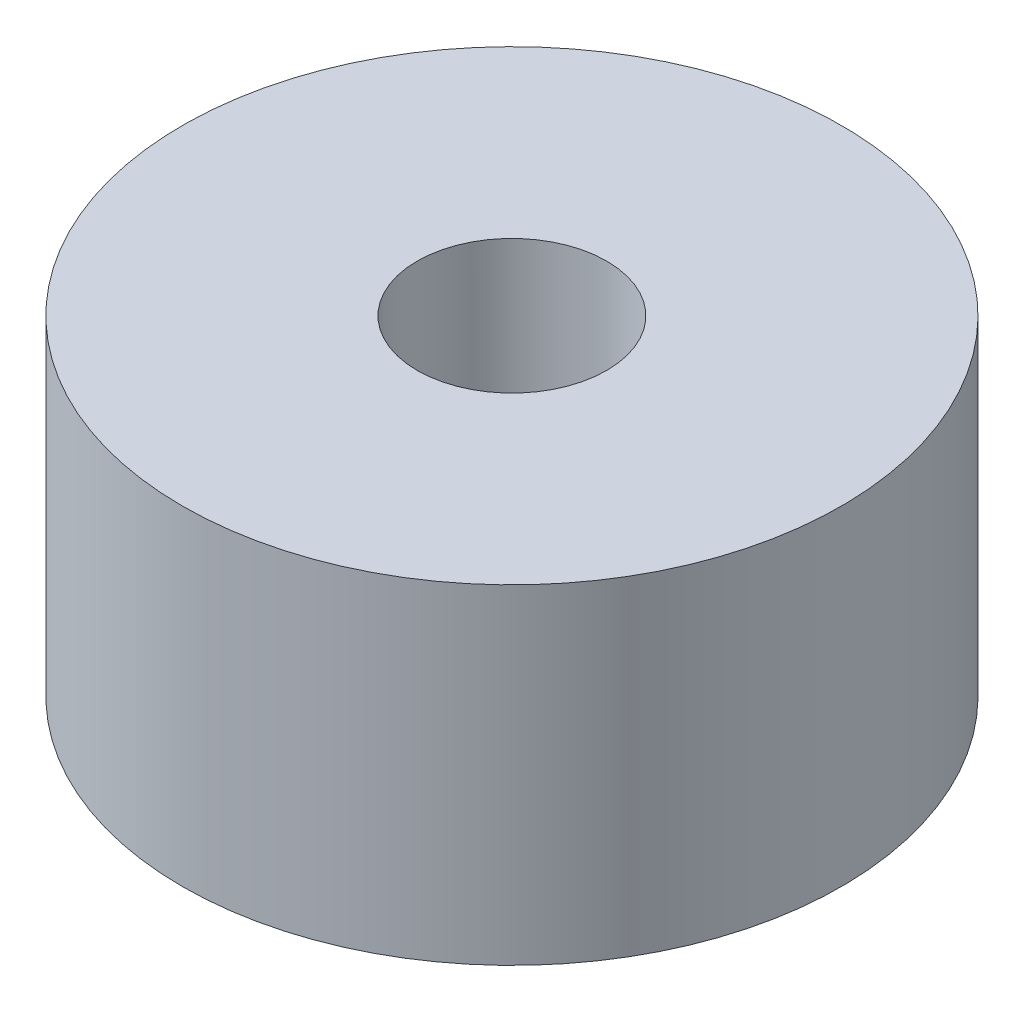
ISO-10303-21;
HEADER;
FILE_DESCRIPTION(('STEP AP214'),'2;1');
FILE_NAME('part.step','',(''),(''),'','','');
FILE_SCHEMA(('AUTOMOTIVE_DESIGN { 1 0 10303 214 1 1 1 1 }'));
ENDSEC;
DATA;
#1=APPLICATION_CONTEXT('core data for automotive mechanical design processes');
#2=APPLICATION_PROTOCOL_DEFINITION('international standard','automotive_design',2000,#1);
#3=PRODUCT_CONTEXT('',#1,'mechanical');
#4=PRODUCT('Part','Part','',(#3));
#5=PRODUCT_RELATED_PRODUCT_CATEGORY('part','',(#4));
#6=PRODUCT_DEFINITION_FORMATION('','',#4);
#7=PRODUCT_DEFINITION_CONTEXT('part definition',#1,'design');
#8=PRODUCT_DEFINITION('design','',#6,#7);
#9=PRODUCT_DEFINITION_SHAPE('','',#8);
#10=(LENGTH_UNIT() NAMED_UNIT(*) SI_UNIT(.MILLI.,.METRE.));
#11=(NAMED_UNIT(*) PLANE_ANGLE_UNIT() SI_UNIT($,.RADIAN.));
#12=(NAMED_UNIT(*) SI_UNIT($,.STERADIAN.) SOLID_ANGLE_UNIT());
#13=UNCERTAINTY_MEASURE_WITH_UNIT(LENGTH_MEASURE(1.E-05),#10,'distance_accuracy_value','');
#14=(GEOMETRIC_REPRESENTATION_CONTEXT(3) GLOBAL_UNCERTAINTY_ASSIGNED_CONTEXT((#13)) GLOBAL_UNIT_ASSIGNED_CONTEXT((#10,
#11,#12)) REPRESENTATION_CONTEXT('',''));
#15=CARTESIAN_POINT('',(0.,0.,0.));
#16=DIRECTION('',(0.,0.,1.));
#17=DIRECTION('',(1.,0.,0.));
#18=AXIS2_PLACEMENT_3D('',#15,#16,#17);
#19=CARTESIAN_POINT('',(0.,0.,0.));
#20=DIRECTION('',(0.,1.,0.));
#21=DIRECTION('',(0.,0.,1.));
#22=AXIS2_PLACEMENT_3D('',#19,#20,#21);
#23=PLANE('',#22);
#24=CARTESIAN_POINT('',(0.,0.,0.));
#25=DIRECTION('',(0.,1.,0.));
#26=DIRECTION('',(0.,0.,1.));
#27=AXIS2_PLACEMENT_3D('',#24,#25,#26);
#28=CIRCLE('',#27,12.);
#29=CARTESIAN_POINT('',(0.,0.,12.));
#30=VERTEX_POINT('',#29);
#31=EDGE_CURVE('E218',#30,#30,#28,.T.);
#32=ORIENTED_EDGE('',*,*,#31,.F.);
#33=EDGE_LOOP('',(#32));
#34=FACE_BOUND('',#33,.T.);
#35=DIRECTION('',(0.,0.,-1.));
#36=VECTOR('',#35,1.);
#37=CARTESIAN_POINT('',(8.6,0.,5.5));
#38=LINE('',#37,#36);
#39=CARTESIAN_POINT('',(8.6,0.,5.5));
#40=VERTEX_POINT('',#39);
#41=CARTESIAN_POINT('',(8.6,0.,-5.5));
#42=VERTEX_POINT('',#41);
#43=EDGE_CURVE('E190',#40,#42,#38,.T.);
#44=ORIENTED_EDGE('',*,*,#43,.T.);
#45=DIRECTION('',(-1.,0.,0.));
#46=VECTOR('',#45,1.);
#47=CARTESIAN_POINT('',(-8.6,0.,-5.5));
#48=LINE('',#47,#46);
#49=CARTESIAN_POINT('',(-8.6,0.,-5.5));
#50=VERTEX_POINT('',#49);
#51=EDGE_CURVE('E194',#42,#50,#48,.T.);
#52=ORIENTED_EDGE('',*,*,#51,.T.);
#53=DIRECTION('',(0.,0.,1.));
#54=VECTOR('',#53,1.);
#55=CARTESIAN_POINT('',(-8.6,0.,5.5));
#56=LINE('',#55,#54);
#57=CARTESIAN_POINT('',(-8.6,0.,5.5));
#58=VERTEX_POINT('',#57);
#59=EDGE_CURVE('E198',#50,#58,#56,.T.);
#60=ORIENTED_EDGE('',*,*,#59,.T.);
#61=DIRECTION('',(1.,0.,0.));
#62=VECTOR('',#61,1.);
#63=CARTESIAN_POINT('',(-8.6,0.,5.5));
#64=LINE('',#63,#62);
#65=EDGE_CURVE('E179',#58,#40,#64,.T.);
#66=ORIENTED_EDGE('',*,*,#65,.T.);
#67=EDGE_LOOP('',(#44,#52,#60,#66));
#68=FACE_BOUND('',#67,.T.);
#69=ADVANCED_FACE('F44',(#34,#68),#23,.F.);
#70=CARTESIAN_POINT('',(0.,12.,0.));
#71=DIRECTION('',(0.,-1.,0.));
#72=DIRECTION('',(0.,0.,-1.));
#73=AXIS2_PLACEMENT_3D('',#70,#71,#72);
#74=CYLINDRICAL_SURFACE('',#73,12.);
#75=CARTESIAN_POINT('',(0.,12.,0.));
#76=DIRECTION('',(0.,1.,0.));
#77=DIRECTION('',(0.,0.,1.));
#78=AXIS2_PLACEMENT_3D('',#75,#76,#77);
#79=CIRCLE('',#78,12.);
#80=CARTESIAN_POINT('',(0.,12.,12.));
#81=VERTEX_POINT('',#80);
#82=EDGE_CURVE('E219',#81,#81,#79,.T.);
#83=ORIENTED_EDGE('',*,*,#82,.F.);
#84=EDGE_LOOP('',(#83));
#85=FACE_BOUND('',#84,.T.);
#86=ORIENTED_EDGE('',*,*,#31,.T.);
#87=EDGE_LOOP('',(#86));
#88=FACE_BOUND('',#87,.T.);
#89=ADVANCED_FACE('F291',(#85,#88),#74,.T.);
#90=CARTESIAN_POINT('',(0.,12.,0.));
#91=DIRECTION('',(0.,1.,0.));
#92=DIRECTION('',(0.,0.,1.));
#93=AXIS2_PLACEMENT_3D('',#90,#91,#92);
#94=PLANE('',#93);
#95=CARTESIAN_POINT('',(0.,12.,0.));
#96=DIRECTION('',(0.,1.,0.));
#97=DIRECTION('',(0.,0.,1.));
#98=AXIS2_PLACEMENT_3D('',#95,#96,#97);
#99=CIRCLE('',#98,3.45);
#100=CARTESIAN_POINT('',(0.,12.,3.45));
#101=VERTEX_POINT('',#100);
#102=EDGE_CURVE('E164',#101,#101,#99,.T.);
#103=ORIENTED_EDGE('',*,*,#102,.F.);
#104=EDGE_LOOP('',(#103));
#105=FACE_BOUND('',#104,.T.);
#106=ORIENTED_EDGE('',*,*,#82,.T.);
#107=EDGE_LOOP('',(#106));
#108=FACE_BOUND('',#107,.T.);
#109=ADVANCED_FACE('F288',(#105,#108),#94,.T.);
#110=CARTESIAN_POINT('',(8.6,2.2,5.5));
#111=DIRECTION('',(-1.,0.,0.));
#112=DIRECTION('',(0.,0.,1.));
#113=AXIS2_PLACEMENT_3D('',#110,#111,#112);
#114=PLANE('',#113);
#115=ORIENTED_EDGE('',*,*,#43,.F.);
#116=DIRECTION('',(0.,-1.,0.));
#117=VECTOR('',#116,1.);
#118=CARTESIAN_POINT('',(8.6,2.2,5.5));
#119=LINE('',#118,#117);
#120=CARTESIAN_POINT('',(8.6,2.2,5.5));
#121=VERTEX_POINT('',#120);
#122=EDGE_CURVE('E189',#121,#40,#119,.T.);
#123=ORIENTED_EDGE('',*,*,#122,.F.);
#124=DIRECTION('',(0.,0.,-1.));
#125=VECTOR('',#124,1.);
#126=CARTESIAN_POINT('',(8.6,2.2,5.5));
#127=LINE('',#126,#125);
#128=CARTESIAN_POINT('',(8.6,2.2,-5.5));
#129=VERTEX_POINT('',#128);
#130=EDGE_CURVE('E174',#121,#129,#127,.T.);
#131=ORIENTED_EDGE('',*,*,#130,.T.);
#132=DIRECTION('',(0.,-1.,0.));
#133=VECTOR('',#132,1.);
#134=CARTESIAN_POINT('',(8.6,2.2,-5.5));
#135=LINE('',#134,#133);
#136=EDGE_CURVE('E214',#129,#42,#135,.T.);
#137=ORIENTED_EDGE('',*,*,#136,.T.);
#138=EDGE_LOOP('',(#115,#123,#131,#137));
#139=FACE_BOUND('',#138,.T.);
#140=ADVANCED_FACE('F278',(#139),#114,.T.);
#141=CARTESIAN_POINT('',(-8.6,2.2,-5.5));
#142=DIRECTION('',(0.,0.,1.));
#143=DIRECTION('',(1.,0.,0.));
#144=AXIS2_PLACEMENT_3D('',#141,#142,#143);
#145=PLANE('',#144);
#146=ORIENTED_EDGE('',*,*,#51,.F.);
#147=ORIENTED_EDGE('',*,*,#136,.F.);
#148=DIRECTION('',(-1.,0.,0.));
#149=VECTOR('',#148,1.);
#150=CARTESIAN_POINT('',(-8.6,2.2,-5.5));
#151=LINE('',#150,#149);
#152=CARTESIAN_POINT('',(-8.6,2.2,-5.5));
#153=VERTEX_POINT('',#152);
#154=EDGE_CURVE('E178',#129,#153,#151,.T.);
#155=ORIENTED_EDGE('',*,*,#154,.T.);
#156=DIRECTION('',(0.,-1.,0.));
#157=VECTOR('',#156,1.);
#158=CARTESIAN_POINT('',(-8.6,2.2,-5.5));
#159=LINE('',#158,#157);
#160=EDGE_CURVE('E211',#153,#50,#159,.T.);
#161=ORIENTED_EDGE('',*,*,#160,.T.);
#162=EDGE_LOOP('',(#146,#147,#155,#161));
#163=FACE_BOUND('',#162,.T.);
#164=ADVANCED_FACE('F279',(#163),#145,.T.);
#165=CARTESIAN_POINT('',(-8.6,2.2,5.5));
#166=DIRECTION('',(1.,0.,0.));
#167=DIRECTION('',(0.,0.,-1.));
#168=AXIS2_PLACEMENT_3D('',#165,#166,#167);
#169=PLANE('',#168);
#170=ORIENTED_EDGE('',*,*,#59,.F.);
#171=ORIENTED_EDGE('',*,*,#160,.F.);
#172=DIRECTION('',(0.,0.,1.));
#173=VECTOR('',#172,1.);
#174=CARTESIAN_POINT('',(-8.6,2.2,5.5));
#175=LINE('',#174,#173);
#176=CARTESIAN_POINT('',(-8.6,2.2,-1.75));
#177=VERTEX_POINT('',#176);
#178=EDGE_CURVE('E183',#153,#177,#175,.T.);
#179=ORIENTED_EDGE('',*,*,#178,.T.);
#180=CARTESIAN_POINT('',(-8.6,2.7,-1.75));
#181=DIRECTION('',(1.,0.,0.));
#182=DIRECTION('',(0.,0.,-1.));
#183=AXIS2_PLACEMENT_3D('',#180,#181,#182);
#184=CIRCLE('',#183,0.5);
#185=CARTESIAN_POINT('',(-8.6,2.7,-1.25));
#186=VERTEX_POINT('',#185);
#187=EDGE_CURVE('E54',#177,#186,#184,.F.);
#188=ORIENTED_EDGE('',*,*,#187,.T.);
#189=DIRECTION('',(0.,-1.,0.));
#190=VECTOR('',#189,1.);
#191=CARTESIAN_POINT('',(-8.6,4.7,-1.25));
#192=LINE('',#191,#190);
#193=CARTESIAN_POINT('',(-8.6,4.7,-1.25));
#194=VERTEX_POINT('',#193);
#195=EDGE_CURVE('E124',#194,#186,#192,.T.);
#196=ORIENTED_EDGE('',*,*,#195,.F.);
#197=DIRECTION('',(0.,0.,-1.));
#198=VECTOR('',#197,1.);
#199=CARTESIAN_POINT('',(-8.6,4.7,1.25));
#200=LINE('',#199,#198);
#201=CARTESIAN_POINT('',(-8.6,4.7,1.25));
#202=VERTEX_POINT('',#201);
#203=EDGE_CURVE('E129',#202,#194,#200,.T.);
#204=ORIENTED_EDGE('',*,*,#203,.F.);
#205=DIRECTION('',(0.,-1.,0.));
#206=VECTOR('',#205,1.);
#207=CARTESIAN_POINT('',(-8.6,4.7,1.25));
#208=LINE('',#207,#206);
#209=CARTESIAN_POINT('',(-8.6,2.7,1.25));
#210=VERTEX_POINT('',#209);
#211=EDGE_CURVE('E161',#202,#210,#208,.T.);
#212=ORIENTED_EDGE('',*,*,#211,.T.);
#213=CARTESIAN_POINT('',(-8.6,2.7,1.75));
#214=DIRECTION('',(1.,0.,0.));
#215=DIRECTION('',(0.,0.,-1.));
#216=AXIS2_PLACEMENT_3D('',#213,#214,#215);
#217=CIRCLE('',#216,0.5);
#218=CARTESIAN_POINT('',(-8.6,2.2,1.75));
#219=VERTEX_POINT('',#218);
#220=EDGE_CURVE('E11',#210,#219,#217,.F.);
#221=ORIENTED_EDGE('',*,*,#220,.T.);
#222=CARTESIAN_POINT('',(-8.6,2.2,5.5));
#223=VERTEX_POINT('',#222);
#224=EDGE_CURVE('E182',#219,#223,#175,.T.);
#225=ORIENTED_EDGE('',*,*,#224,.T.);
#226=DIRECTION('',(0.,-1.,0.));
#227=VECTOR('',#226,1.);
#228=CARTESIAN_POINT('',(-8.6,2.2,5.5));
#229=LINE('',#228,#227);
#230=EDGE_CURVE('E208',#223,#58,#229,.T.);
#231=ORIENTED_EDGE('',*,*,#230,.T.);
#232=EDGE_LOOP('',(#170,#171,#179,#188,#196,#204,#212,#221,#225,#231));
#233=FACE_BOUND('',#232,.T.);
#234=ADVANCED_FACE('F127',(#233),#169,.T.);
#235=CARTESIAN_POINT('',(-8.6,2.2,5.5));
#236=DIRECTION('',(0.,0.,-1.));
#237=DIRECTION('',(-1.,0.,0.));
#238=AXIS2_PLACEMENT_3D('',#235,#236,#237);
#239=PLANE('',#238);
#240=ORIENTED_EDGE('',*,*,#65,.F.);
#241=ORIENTED_EDGE('',*,*,#230,.F.);
#242=DIRECTION('',(1.,0.,0.));
#243=VECTOR('',#242,1.);
#244=CARTESIAN_POINT('',(-8.6,2.2,5.5));
#245=LINE('',#244,#243);
#246=EDGE_CURVE('E186',#223,#121,#245,.T.);
#247=ORIENTED_EDGE('',*,*,#246,.T.);
#248=ORIENTED_EDGE('',*,*,#122,.T.);
#249=EDGE_LOOP('',(#240,#241,#247,#248));
#250=FACE_BOUND('',#249,.T.);
#251=ADVANCED_FACE('F270',(#250),#239,.T.);
#252=CARTESIAN_POINT('',(0.,2.2,0.));
#253=DIRECTION('',(0.,-1.,0.));
#254=DIRECTION('',(0.,0.,-1.));
#255=AXIS2_PLACEMENT_3D('',#252,#253,#254);
#256=PLANE('',#255);
#257=DIRECTION('',(0.,0.,1.));
#258=VECTOR('',#257,1.);
#259=CARTESIAN_POINT('',(-6.40132378222621,2.2,-1.25));
#260=LINE('',#259,#258);
#261=CARTESIAN_POINT('',(-6.40132378222621,2.2,1.75));
#262=VERTEX_POINT('',#261);
#263=CARTESIAN_POINT('',(-6.40132378222621,2.2,-1.75));
#264=VERTEX_POINT('',#263);
#265=EDGE_CURVE('E232',#262,#264,#260,.F.);
#266=ORIENTED_EDGE('',*,*,#265,.T.);
#267=DIRECTION('',(1.,0.,0.));
#268=VECTOR('',#267,1.);
#269=CARTESIAN_POINT('',(-8.6,2.2,-1.75));
#270=LINE('',#269,#268);
#271=EDGE_CURVE('E238',#264,#177,#270,.F.);
#272=ORIENTED_EDGE('',*,*,#271,.T.);
#273=ORIENTED_EDGE('',*,*,#178,.F.);
#274=ORIENTED_EDGE('',*,*,#154,.F.);
#275=ORIENTED_EDGE('',*,*,#130,.F.);
#276=ORIENTED_EDGE('',*,*,#246,.F.);
#277=ORIENTED_EDGE('',*,*,#224,.F.);
#278=DIRECTION('',(-1.,0.,0.));
#279=VECTOR('',#278,1.);
#280=CARTESIAN_POINT('',(-6.90132378222621,2.2,1.75));
#281=LINE('',#280,#279);
#282=EDGE_CURVE('E235',#219,#262,#281,.F.);
#283=ORIENTED_EDGE('',*,*,#282,.T.);
#284=EDGE_LOOP('',(#266,#272,#273,#274,#275,#276,#277,#283));
#285=FACE_BOUND('',#284,.T.);
#286=CARTESIAN_POINT('',(0.,2.2,0.));
#287=DIRECTION('',(0.,-1.,0.));
#288=DIRECTION('',(0.,0.,-1.));
#289=AXIS2_PLACEMENT_3D('',#286,#287,#288);
#290=CIRCLE('',#289,3.45);
#291=CARTESIAN_POINT('',(0.,2.2,-3.45));
#292=VERTEX_POINT('',#291);
#293=EDGE_CURVE('E173',#292,#292,#290,.F.);
#294=ORIENTED_EDGE('',*,*,#293,.T.);
#295=EDGE_LOOP('',(#294));
#296=FACE_BOUND('',#295,.T.);
#297=ADVANCED_FACE('F262',(#285,#296),#256,.T.);
#298=CARTESIAN_POINT('',(0.,12.,0.));
#299=DIRECTION('',(0.,-1.,0.));
#300=DIRECTION('',(0.,0.,-1.));
#301=AXIS2_PLACEMENT_3D('',#298,#299,#300);
#302=CYLINDRICAL_SURFACE('',#301,3.45);
#303=ORIENTED_EDGE('',*,*,#293,.F.);
#304=EDGE_LOOP('',(#303));
#305=FACE_BOUND('',#304,.T.);
#306=ORIENTED_EDGE('',*,*,#102,.T.);
#307=EDGE_LOOP('',(#306));
#308=FACE_BOUND('',#307,.T.);
#309=ADVANCED_FACE('F319',(#305,#308),#302,.F.);
#310=CARTESIAN_POINT('',(-8.6,4.7,1.25));
#311=DIRECTION('',(0.,0.,1.));
#312=DIRECTION('',(1.,0.,0.));
#313=AXIS2_PLACEMENT_3D('',#310,#311,#312);
#314=PLANE('',#313);
#315=DIRECTION('',(0.,-1.,0.));
#316=VECTOR('',#315,1.);
#317=CARTESIAN_POINT('',(-6.90132378222621,4.7,1.25));
#318=LINE('',#317,#316);
#319=CARTESIAN_POINT('',(-6.90132378222621,4.7,1.25));
#320=VERTEX_POINT('',#319);
#321=CARTESIAN_POINT('',(-6.90132378222621,2.7,1.25));
#322=VERTEX_POINT('',#321);
#323=EDGE_CURVE('E165',#320,#322,#318,.T.);
#324=ORIENTED_EDGE('',*,*,#323,.T.);
#325=DIRECTION('',(-1.,0.,0.));
#326=VECTOR('',#325,1.);
#327=CARTESIAN_POINT('',(-8.6,2.7,1.25));
#328=LINE('',#327,#326);
#329=EDGE_CURVE('E69',#322,#210,#328,.T.);
#330=ORIENTED_EDGE('',*,*,#329,.T.);
#331=ORIENTED_EDGE('',*,*,#211,.F.);
#332=DIRECTION('',(-1.,0.,0.));
#333=VECTOR('',#332,1.);
#334=CARTESIAN_POINT('',(-8.6,4.7,1.25));
#335=LINE('',#334,#333);
#336=EDGE_CURVE('E138',#320,#202,#335,.T.);
#337=ORIENTED_EDGE('',*,*,#336,.F.);
#338=EDGE_LOOP('',(#324,#330,#331,#337));
#339=FACE_BOUND('',#338,.T.);
#340=ADVANCED_FACE('F256',(#339),#314,.F.);
#341=CARTESIAN_POINT('',(-6.90132378222621,4.7,1.25));
#342=DIRECTION('',(1.,0.,0.));
#343=DIRECTION('',(0.,0.,-1.));
#344=AXIS2_PLACEMENT_3D('',#341,#342,#343);
#345=PLANE('',#344);
#346=DIRECTION('',(0.,-1.,0.));
#347=VECTOR('',#346,1.);
#348=CARTESIAN_POINT('',(-6.90132378222621,4.7,-1.25));
#349=LINE('',#348,#347);
#350=CARTESIAN_POINT('',(-6.90132378222621,4.7,-1.25));
#351=VERTEX_POINT('',#350);
#352=CARTESIAN_POINT('',(-6.90132378222621,2.7,-1.25));
#353=VERTEX_POINT('',#352);
#354=EDGE_CURVE('E137',#351,#353,#349,.T.);
#355=ORIENTED_EDGE('',*,*,#354,.T.);
#356=DIRECTION('',(0.,0.,1.));
#357=VECTOR('',#356,1.);
#358=CARTESIAN_POINT('',(-6.90132378222621,2.7,1.25));
#359=LINE('',#358,#357);
#360=EDGE_CURVE('E62',#353,#322,#359,.T.);
#361=ORIENTED_EDGE('',*,*,#360,.T.);
#362=ORIENTED_EDGE('',*,*,#323,.F.);
#363=DIRECTION('',(0.,0.,1.));
#364=VECTOR('',#363,1.);
#365=CARTESIAN_POINT('',(-6.90132378222621,4.7,1.25));
#366=LINE('',#365,#364);
#367=EDGE_CURVE('E147',#351,#320,#366,.T.);
#368=ORIENTED_EDGE('',*,*,#367,.F.);
#369=EDGE_LOOP('',(#355,#361,#362,#368));
#370=FACE_BOUND('',#369,.T.);
#371=ADVANCED_FACE('F255',(#370),#345,.F.);
#372=CARTESIAN_POINT('',(-8.6,4.7,-1.25));
#373=DIRECTION('',(0.,0.,-1.));
#374=DIRECTION('',(-1.,0.,0.));
#375=AXIS2_PLACEMENT_3D('',#372,#373,#374);
#376=PLANE('',#375);
#377=ORIENTED_EDGE('',*,*,#195,.T.);
#378=DIRECTION('',(1.,0.,0.));
#379=VECTOR('',#378,1.);
#380=CARTESIAN_POINT('',(-6.90132378222621,2.7,-1.25));
#381=LINE('',#380,#379);
#382=EDGE_CURVE('E223',#186,#353,#381,.T.);
#383=ORIENTED_EDGE('',*,*,#382,.T.);
#384=ORIENTED_EDGE('',*,*,#354,.F.);
#385=DIRECTION('',(1.,0.,0.));
#386=VECTOR('',#385,1.);
#387=CARTESIAN_POINT('',(-8.6,4.7,-1.25));
#388=LINE('',#387,#386);
#389=EDGE_CURVE('E141',#194,#351,#388,.T.);
#390=ORIENTED_EDGE('',*,*,#389,.F.);
#391=EDGE_LOOP('',(#377,#383,#384,#390));
#392=FACE_BOUND('',#391,.T.);
#393=ADVANCED_FACE('F142',(#392),#376,.F.);
#394=CARTESIAN_POINT('',(0.,4.7,0.));
#395=DIRECTION('',(0.,-1.,0.));
#396=DIRECTION('',(0.,0.,-1.));
#397=AXIS2_PLACEMENT_3D('',#394,#395,#396);
#398=PLANE('',#397);
#399=ORIENTED_EDGE('',*,*,#203,.T.);
#400=ORIENTED_EDGE('',*,*,#389,.T.);
#401=ORIENTED_EDGE('',*,*,#367,.T.);
#402=ORIENTED_EDGE('',*,*,#336,.T.);
#403=EDGE_LOOP('',(#399,#400,#401,#402));
#404=FACE_BOUND('',#403,.T.);
#405=ADVANCED_FACE('F149',(#404),#398,.T.);
#406=CARTESIAN_POINT('',(-8.6,2.7,1.75));
#407=DIRECTION('',(1.,0.,0.));
#408=DIRECTION('',(0.,0.,-1.));
#409=AXIS2_PLACEMENT_3D('',#406,#407,#408);
#410=CYLINDRICAL_SURFACE('',#409,0.5);
#411=ORIENTED_EDGE('',*,*,#220,.F.);
#412=ORIENTED_EDGE('',*,*,#329,.F.);
#413=CARTESIAN_POINT('',(-6.40132378222621,2.7,1.75));
#414=DIRECTION('',(0.707106781186547,0.,-0.707106781186548));
#415=DIRECTION('',(0.707106781186548,0.,0.707106781186547));
#416=AXIS2_PLACEMENT_3D('',#413,#414,#415);
#417=ELLIPSE('',#416,0.707106781186547,0.5);
#418=EDGE_CURVE('E48',#262,#322,#417,.T.);
#419=ORIENTED_EDGE('',*,*,#418,.F.);
#420=ORIENTED_EDGE('',*,*,#282,.F.);
#421=EDGE_LOOP('',(#411,#412,#419,#420));
#422=FACE_BOUND('',#421,.T.);
#423=ADVANCED_FACE('F46',(#422),#410,.T.);
#424=CARTESIAN_POINT('',(-6.40132378222621,2.7,1.25));
#425=DIRECTION('',(0.,0.,-1.));
#426=DIRECTION('',(-1.,0.,0.));
#427=AXIS2_PLACEMENT_3D('',#424,#425,#426);
#428=CYLINDRICAL_SURFACE('',#427,0.5);
#429=ORIENTED_EDGE('',*,*,#418,.T.);
#430=ORIENTED_EDGE('',*,*,#360,.F.);
#431=CARTESIAN_POINT('',(-6.40132378222621,2.7,-1.75));
#432=DIRECTION('',(-0.707106781186547,0.,-0.707106781186547));
#433=DIRECTION('',(-0.707106781186547,0.,0.707106781186547));
#434=AXIS2_PLACEMENT_3D('',#431,#432,#433);
#435=ELLIPSE('',#434,0.707106781186547,0.5);
#436=EDGE_CURVE('E155',#264,#353,#435,.T.);
#437=ORIENTED_EDGE('',*,*,#436,.F.);
#438=ORIENTED_EDGE('',*,*,#265,.F.);
#439=EDGE_LOOP('',(#429,#430,#437,#438));
#440=FACE_BOUND('',#439,.T.);
#441=ADVANCED_FACE('F253',(#440),#428,.T.);
#442=CARTESIAN_POINT('',(-8.6,2.7,-1.75));
#443=DIRECTION('',(-1.,0.,0.));
#444=DIRECTION('',(0.,0.,1.));
#445=AXIS2_PLACEMENT_3D('',#442,#443,#444);
#446=CYLINDRICAL_SURFACE('',#445,0.5);
#447=ORIENTED_EDGE('',*,*,#187,.F.);
#448=ORIENTED_EDGE('',*,*,#271,.F.);
#449=ORIENTED_EDGE('',*,*,#436,.T.);
#450=ORIENTED_EDGE('',*,*,#382,.F.);
#451=EDGE_LOOP('',(#447,#448,#449,#450));
#452=FACE_BOUND('',#451,.T.);
#453=ADVANCED_FACE('F250',(#452),#446,.T.);
#454=CLOSED_SHELL('',(#69,#89,#109,#140,#164,#234,#251,#297,#309,#340,#371,#393,#405,#423,#441,#453));
#455=MANIFOLD_SOLID_BREP('B2',#454);
#456=ADVANCED_BREP_SHAPE_REPRESENTATION('',(#18,#455),#14);
#457=SHAPE_DEFINITION_REPRESENTATION(#9,#456);
ENDSEC;
END-ISO-10303-21;
